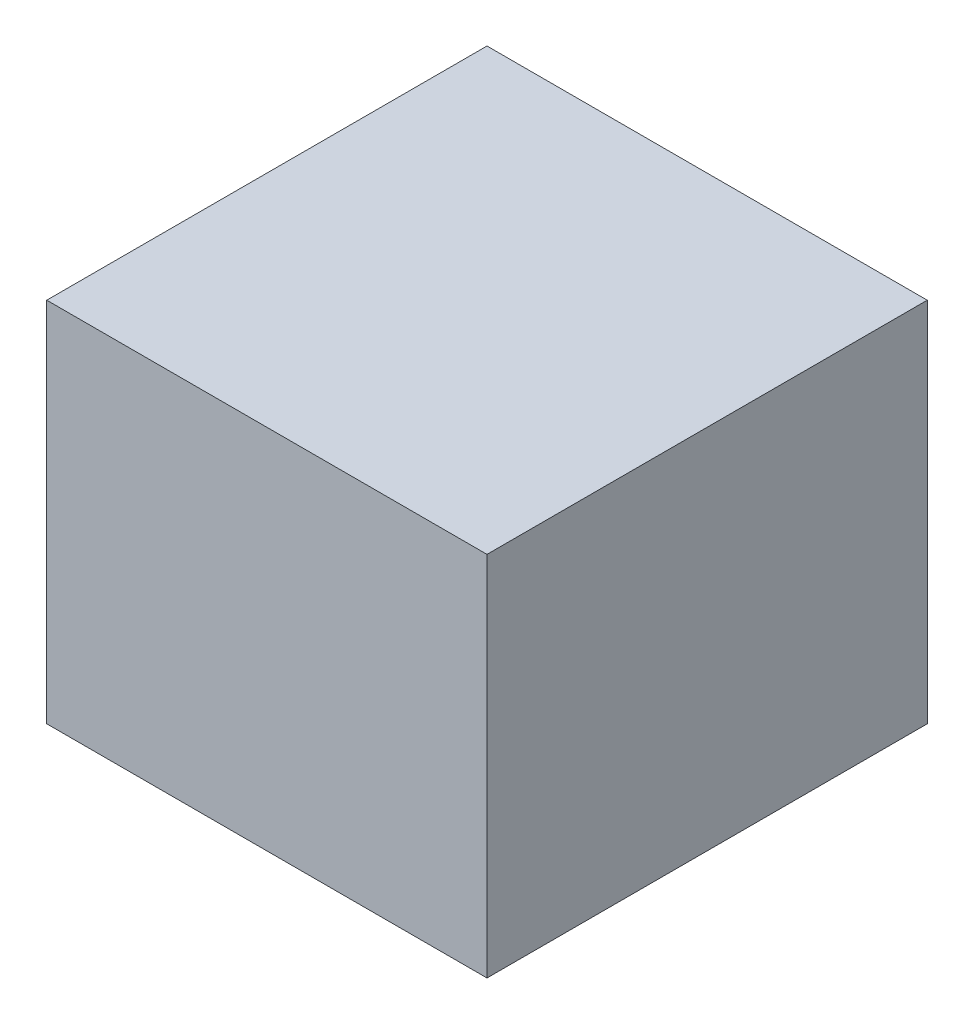
ISO-10303-21;
HEADER;
FILE_DESCRIPTION(('STEP AP214'),'2;1');
FILE_NAME('part.step','',(''),(''),'','','');
FILE_SCHEMA(('AUTOMOTIVE_DESIGN { 1 0 10303 214 1 1 1 1 }'));
ENDSEC;
DATA;
#1=APPLICATION_CONTEXT('core data for automotive mechanical design processes');
#2=APPLICATION_PROTOCOL_DEFINITION('international standard','automotive_design',2000,#1);
#3=PRODUCT_CONTEXT('',#1,'mechanical');
#4=PRODUCT('Part','Part','',(#3));
#5=PRODUCT_RELATED_PRODUCT_CATEGORY('part','',(#4));
#6=PRODUCT_DEFINITION_FORMATION('','',#4);
#7=PRODUCT_DEFINITION_CONTEXT('part definition',#1,'design');
#8=PRODUCT_DEFINITION('design','',#6,#7);
#9=PRODUCT_DEFINITION_SHAPE('','',#8);
#10=(LENGTH_UNIT() NAMED_UNIT(*) SI_UNIT(.MILLI.,.METRE.));
#11=(NAMED_UNIT(*) PLANE_ANGLE_UNIT() SI_UNIT($,.RADIAN.));
#12=(NAMED_UNIT(*) SI_UNIT($,.STERADIAN.) SOLID_ANGLE_UNIT());
#13=UNCERTAINTY_MEASURE_WITH_UNIT(LENGTH_MEASURE(1.E-05),#10,'distance_accuracy_value','');
#14=(GEOMETRIC_REPRESENTATION_CONTEXT(3) GLOBAL_UNCERTAINTY_ASSIGNED_CONTEXT((#13)) GLOBAL_UNIT_ASSIGNED_CONTEXT((#10,
#11,#12)) REPRESENTATION_CONTEXT('',''));
#15=CARTESIAN_POINT('',(0.,0.,0.));
#16=DIRECTION('',(0.,0.,1.));
#17=DIRECTION('',(1.,0.,0.));
#18=AXIS2_PLACEMENT_3D('',#15,#16,#17);
#19=CARTESIAN_POINT('',(-31.0339909674352,220.905633468029,300.));
#20=DIRECTION('',(0.,1.,0.));
#21=DIRECTION('',(0.,0.,1.));
#22=AXIS2_PLACEMENT_3D('',#19,#20,#21);
#23=PLANE('',#22);
#24=DIRECTION('',(1.,0.,0.));
#25=VECTOR('',#24,1.);
#26=CARTESIAN_POINT('',(-31.0339909674352,220.905633468029,0.));
#27=LINE('',#26,#25);
#28=CARTESIAN_POINT('',(-31.0339909674352,220.905633468029,0.));
#29=VERTEX_POINT('',#28);
#30=CARTESIAN_POINT('',(268.966009032565,220.905633468029,0.));
#31=VERTEX_POINT('',#30);
#32=EDGE_CURVE('E98',#29,#31,#27,.T.);
#33=ORIENTED_EDGE('',*,*,#32,.F.);
#34=DIRECTION('',(0.,0.,-1.));
#35=VECTOR('',#34,1.);
#36=CARTESIAN_POINT('',(-31.0339909674352,220.905633468029,300.));
#37=LINE('',#36,#35);
#38=CARTESIAN_POINT('',(-31.0339909674352,220.905633468029,300.));
#39=VERTEX_POINT('',#38);
#40=EDGE_CURVE('E11',#39,#29,#37,.T.);
#41=ORIENTED_EDGE('',*,*,#40,.F.);
#42=DIRECTION('',(1.,0.,0.));
#43=VECTOR('',#42,1.);
#44=CARTESIAN_POINT('',(-31.0339909674352,220.905633468029,300.));
#45=LINE('',#44,#43);
#46=CARTESIAN_POINT('',(268.966009032565,220.905633468029,300.));
#47=VERTEX_POINT('',#46);
#48=EDGE_CURVE('E93',#39,#47,#45,.T.);
#49=ORIENTED_EDGE('',*,*,#48,.T.);
#50=DIRECTION('',(0.,0.,-1.));
#51=VECTOR('',#50,1.);
#52=CARTESIAN_POINT('',(268.966009032565,220.905633468029,300.));
#53=LINE('',#52,#51);
#54=EDGE_CURVE('E36',#47,#31,#53,.T.);
#55=ORIENTED_EDGE('',*,*,#54,.T.);
#56=EDGE_LOOP('',(#33,#41,#49,#55));
#57=FACE_BOUND('',#56,.T.);
#58=ADVANCED_FACE('F33',(#57),#23,.T.);
#59=CARTESIAN_POINT('',(-31.0339909674352,220.905633468029,300.));
#60=DIRECTION('',(1.,0.,0.));
#61=DIRECTION('',(0.,1.,0.));
#62=AXIS2_PLACEMENT_3D('',#59,#60,#61);
#63=PLANE('',#62);
#64=DIRECTION('',(0.,-1.,0.));
#65=VECTOR('',#64,1.);
#66=CARTESIAN_POINT('',(-31.0339909674352,220.905633468029,0.));
#67=LINE('',#66,#65);
#68=CARTESIAN_POINT('',(-31.0339909674352,-29.0943665319705,0.));
#69=VERTEX_POINT('',#68);
#70=EDGE_CURVE('E66',#29,#69,#67,.T.);
#71=ORIENTED_EDGE('',*,*,#70,.T.);
#72=DIRECTION('',(0.,0.,-1.));
#73=VECTOR('',#72,1.);
#74=CARTESIAN_POINT('',(-31.0339909674352,-29.0943665319705,300.));
#75=LINE('',#74,#73);
#76=CARTESIAN_POINT('',(-31.0339909674352,-29.0943665319705,300.));
#77=VERTEX_POINT('',#76);
#78=EDGE_CURVE('E42',#77,#69,#75,.T.);
#79=ORIENTED_EDGE('',*,*,#78,.F.);
#80=DIRECTION('',(0.,-1.,0.));
#81=VECTOR('',#80,1.);
#82=CARTESIAN_POINT('',(-31.0339909674352,220.905633468029,300.));
#83=LINE('',#82,#81);
#84=EDGE_CURVE('E83',#39,#77,#83,.T.);
#85=ORIENTED_EDGE('',*,*,#84,.F.);
#86=ORIENTED_EDGE('',*,*,#40,.T.);
#87=EDGE_LOOP('',(#71,#79,#85,#86));
#88=FACE_BOUND('',#87,.T.);
#89=ADVANCED_FACE('F108',(#88),#63,.F.);
#90=CARTESIAN_POINT('',(-31.0339909674352,-29.0943665319705,300.));
#91=DIRECTION('',(0.,1.,0.));
#92=DIRECTION('',(0.,0.,1.));
#93=AXIS2_PLACEMENT_3D('',#90,#91,#92);
#94=PLANE('',#93);
#95=DIRECTION('',(1.,0.,0.));
#96=VECTOR('',#95,1.);
#97=CARTESIAN_POINT('',(-31.0339909674352,-29.0943665319705,0.));
#98=LINE('',#97,#96);
#99=CARTESIAN_POINT('',(268.966009032565,-29.0943665319705,0.));
#100=VERTEX_POINT('',#99);
#101=EDGE_CURVE('E90',#69,#100,#98,.T.);
#102=ORIENTED_EDGE('',*,*,#101,.T.);
#103=DIRECTION('',(0.,0.,-1.));
#104=VECTOR('',#103,1.);
#105=CARTESIAN_POINT('',(268.966009032565,-29.0943665319705,300.));
#106=LINE('',#105,#104);
#107=CARTESIAN_POINT('',(268.966009032565,-29.0943665319705,300.));
#108=VERTEX_POINT('',#107);
#109=EDGE_CURVE('E87',#108,#100,#106,.T.);
#110=ORIENTED_EDGE('',*,*,#109,.F.);
#111=DIRECTION('',(1.,0.,0.));
#112=VECTOR('',#111,1.);
#113=CARTESIAN_POINT('',(-31.0339909674352,-29.0943665319705,300.));
#114=LINE('',#113,#112);
#115=EDGE_CURVE('E78',#77,#108,#114,.T.);
#116=ORIENTED_EDGE('',*,*,#115,.F.);
#117=ORIENTED_EDGE('',*,*,#78,.T.);
#118=EDGE_LOOP('',(#102,#110,#116,#117));
#119=FACE_BOUND('',#118,.T.);
#120=ADVANCED_FACE('F88',(#119),#94,.F.);
#121=CARTESIAN_POINT('',(268.966009032565,220.905633468029,300.));
#122=DIRECTION('',(1.,0.,0.));
#123=DIRECTION('',(0.,1.,0.));
#124=AXIS2_PLACEMENT_3D('',#121,#122,#123);
#125=PLANE('',#124);
#126=DIRECTION('',(0.,-1.,0.));
#127=VECTOR('',#126,1.);
#128=CARTESIAN_POINT('',(268.966009032565,220.905633468029,0.));
#129=LINE('',#128,#127);
#130=EDGE_CURVE('E101',#31,#100,#129,.T.);
#131=ORIENTED_EDGE('',*,*,#130,.F.);
#132=ORIENTED_EDGE('',*,*,#54,.F.);
#133=DIRECTION('',(0.,-1.,0.));
#134=VECTOR('',#133,1.);
#135=CARTESIAN_POINT('',(268.966009032565,220.905633468029,300.));
#136=LINE('',#135,#134);
#137=EDGE_CURVE('E82',#47,#108,#136,.T.);
#138=ORIENTED_EDGE('',*,*,#137,.T.);
#139=ORIENTED_EDGE('',*,*,#109,.T.);
#140=EDGE_LOOP('',(#131,#132,#138,#139));
#141=FACE_BOUND('',#140,.T.);
#142=ADVANCED_FACE('F92',(#141),#125,.T.);
#143=CARTESIAN_POINT('',(0.,0.,300.));
#144=DIRECTION('',(0.,0.,-1.));
#145=DIRECTION('',(-1.,0.,0.));
#146=AXIS2_PLACEMENT_3D('',#143,#144,#145);
#147=PLANE('',#146);
#148=ORIENTED_EDGE('',*,*,#48,.F.);
#149=ORIENTED_EDGE('',*,*,#84,.T.);
#150=ORIENTED_EDGE('',*,*,#115,.T.);
#151=ORIENTED_EDGE('',*,*,#137,.F.);
#152=EDGE_LOOP('',(#148,#149,#150,#151));
#153=FACE_BOUND('',#152,.T.);
#154=ADVANCED_FACE('F81',(#153),#147,.F.);
#155=CARTESIAN_POINT('',(0.,0.,0.));
#156=DIRECTION('',(0.,0.,-1.));
#157=DIRECTION('',(-1.,0.,0.));
#158=AXIS2_PLACEMENT_3D('',#155,#156,#157);
#159=PLANE('',#158);
#160=ORIENTED_EDGE('',*,*,#32,.T.);
#161=ORIENTED_EDGE('',*,*,#130,.T.);
#162=ORIENTED_EDGE('',*,*,#101,.F.);
#163=ORIENTED_EDGE('',*,*,#70,.F.);
#164=EDGE_LOOP('',(#160,#161,#162,#163));
#165=FACE_BOUND('',#164,.T.);
#166=ADVANCED_FACE('F106',(#165),#159,.T.);
#167=CLOSED_SHELL('',(#58,#89,#120,#142,#154,#166));
#168=MANIFOLD_SOLID_BREP('B2',#167);
#169=ADVANCED_BREP_SHAPE_REPRESENTATION('',(#18,#168),#14);
#170=SHAPE_DEFINITION_REPRESENTATION(#9,#169);
ENDSEC;
END-ISO-10303-21;
